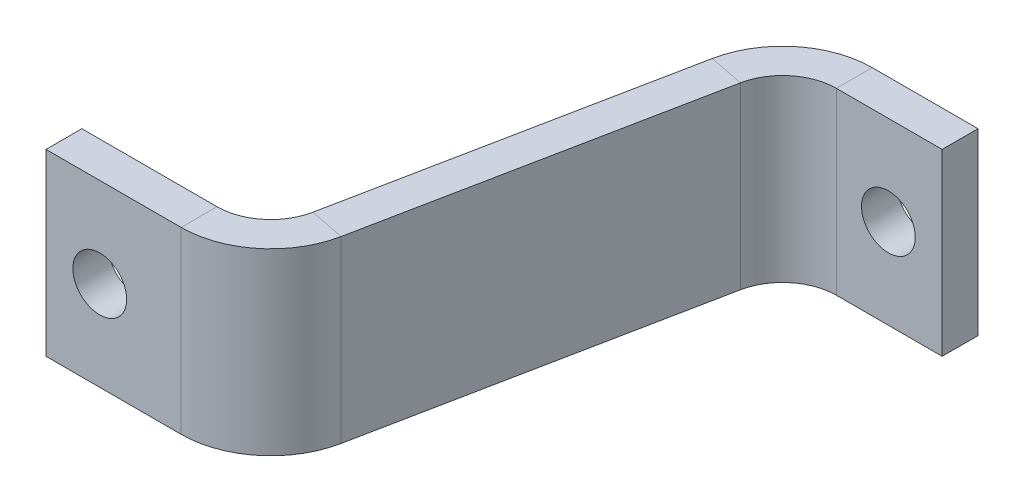
ISO-10303-21;
HEADER;
FILE_DESCRIPTION(('STEP AP214'),'2;1');
FILE_NAME('part.step','',(''),(''),'','','');
FILE_SCHEMA(('AUTOMOTIVE_DESIGN { 1 0 10303 214 1 1 1 1 }'));
ENDSEC;
DATA;
#1=APPLICATION_CONTEXT('core data for automotive mechanical design processes');
#2=APPLICATION_PROTOCOL_DEFINITION('international standard','automotive_design',2000,#1);
#3=PRODUCT_CONTEXT('',#1,'mechanical');
#4=PRODUCT('Part','Part','',(#3));
#5=PRODUCT_RELATED_PRODUCT_CATEGORY('part','',(#4));
#6=PRODUCT_DEFINITION_FORMATION('','',#4);
#7=PRODUCT_DEFINITION_CONTEXT('part definition',#1,'design');
#8=PRODUCT_DEFINITION('design','',#6,#7);
#9=PRODUCT_DEFINITION_SHAPE('','',#8);
#10=(LENGTH_UNIT() NAMED_UNIT(*) SI_UNIT(.MILLI.,.METRE.));
#11=(NAMED_UNIT(*) PLANE_ANGLE_UNIT() SI_UNIT($,.RADIAN.));
#12=(NAMED_UNIT(*) SI_UNIT($,.STERADIAN.) SOLID_ANGLE_UNIT());
#13=UNCERTAINTY_MEASURE_WITH_UNIT(LENGTH_MEASURE(1.E-05),#10,'distance_accuracy_value','');
#14=(GEOMETRIC_REPRESENTATION_CONTEXT(3) GLOBAL_UNCERTAINTY_ASSIGNED_CONTEXT((#13)) GLOBAL_UNIT_ASSIGNED_CONTEXT((#10,
#11,#12)) REPRESENTATION_CONTEXT('',''));
#15=CARTESIAN_POINT('',(0.,0.,0.));
#16=DIRECTION('',(0.,0.,1.));
#17=DIRECTION('',(1.,0.,0.));
#18=AXIS2_PLACEMENT_3D('',#15,#16,#17);
#19=CARTESIAN_POINT('',(-47.2958788935065,10.,20.0273699077237));
#20=DIRECTION('',(0.,1.,0.));
#21=DIRECTION('',(0.,0.,1.));
#22=AXIS2_PLACEMENT_3D('',#19,#20,#21);
#23=PLANE('',#22);
#24=DIRECTION('',(0.98058067569092,0.,0.196116135138183));
#25=VECTOR('',#24,1.);
#26=CARTESIAN_POINT('',(-47.2958788935065,10.,20.0273699077237));
#27=LINE('',#26,#25);
#28=CARTESIAN_POINT('',(-47.2958788935065,10.,20.0273699077237));
#29=VERTEX_POINT('',#28);
#30=CARTESIAN_POINT('',(-45.3347175421246,10.,20.4196021780001));
#31=VERTEX_POINT('',#30);
#32=EDGE_CURVE('E11',#29,#31,#27,.T.);
#33=ORIENTED_EDGE('',*,*,#32,.F.);
#34=CARTESIAN_POINT('',(-50.2376209205792,10.,19.4390215023091));
#35=DIRECTION('',(0.,-1.,0.));
#36=DIRECTION('',(0.,0.,-1.));
#37=AXIS2_PLACEMENT_3D('',#34,#35,#36);
#38=CIRCLE('',#37,3.);
#39=CARTESIAN_POINT('',(-50.2376209205792,10.,22.4390215023091));
#40=VERTEX_POINT('',#39);
#41=EDGE_CURVE('E264',#40,#29,#38,.F.);
#42=ORIENTED_EDGE('',*,*,#41,.F.);
#43=DIRECTION('',(0.,0.,-1.));
#44=VECTOR('',#43,1.);
#45=CARTESIAN_POINT('',(-50.2376209205792,10.,24.4390215023091));
#46=LINE('',#45,#44);
#47=CARTESIAN_POINT('',(-50.2376209205792,10.,24.4390215023091));
#48=VERTEX_POINT('',#47);
#49=EDGE_CURVE('E49',#48,#40,#46,.T.);
#50=ORIENTED_EDGE('',*,*,#49,.F.);
#51=CARTESIAN_POINT('',(-50.2376209205792,10.,19.4390215023091));
#52=DIRECTION('',(0.,1.,0.));
#53=DIRECTION('',(1.,0.,0.));
#54=AXIS2_PLACEMENT_3D('',#51,#52,#53);
#55=CIRCLE('',#54,5.);
#56=EDGE_CURVE('E151',#48,#31,#55,.T.);
#57=ORIENTED_EDGE('',*,*,#56,.T.);
#58=EDGE_LOOP('',(#33,#42,#50,#57));
#59=FACE_BOUND('',#58,.T.);
#60=ADVANCED_FACE('F40',(#59),#23,.T.);
#61=CARTESIAN_POINT('',(-50.2376209205792,10.,24.4390215023091));
#62=DIRECTION('',(0.,1.,0.));
#63=DIRECTION('',(0.,0.,1.));
#64=AXIS2_PLACEMENT_3D('',#61,#62,#63);
#65=PLANE('',#64);
#66=DIRECTION('',(0.196116135138184,0.,-0.98058067569092));
#67=VECTOR('',#66,1.);
#68=CARTESIAN_POINT('',(-47.7782092124236,10.,22.4390215023091));
#69=LINE('',#68,#67);
#70=CARTESIAN_POINT('',(-43.5820930772854,10.,1.45844082661823));
#71=VERTEX_POINT('',#70);
#72=EDGE_CURVE('E145',#29,#71,#69,.T.);
#73=ORIENTED_EDGE('',*,*,#72,.F.);
#74=ORIENTED_EDGE('',*,*,#32,.T.);
#75=DIRECTION('',(0.196116135138184,0.,-0.98058067569092));
#76=VECTOR('',#75,1.);
#77=CARTESIAN_POINT('',(-45.8170478610417,10.,22.8312537725855));
#78=LINE('',#77,#76);
#79=CARTESIAN_POINT('',(-41.6209317259035,10.,1.8506730968946));
#80=VERTEX_POINT('',#79);
#81=EDGE_CURVE('E142',#31,#80,#78,.T.);
#82=ORIENTED_EDGE('',*,*,#81,.T.);
#83=DIRECTION('',(-0.98058067569092,0.,-0.196116135138182));
#84=VECTOR('',#83,1.);
#85=CARTESIAN_POINT('',(-41.6209317259035,10.,1.8506730968946));
#86=LINE('',#85,#84);
#87=EDGE_CURVE('E234',#80,#71,#86,.T.);
#88=ORIENTED_EDGE('',*,*,#87,.T.);
#89=EDGE_LOOP('',(#73,#74,#82,#88));
#90=FACE_BOUND('',#89,.T.);
#91=ADVANCED_FACE('F140',(#90),#65,.T.);
#92=CARTESIAN_POINT('',(-50.2376209205792,0.,22.4390215023091));
#93=DIRECTION('',(0.,-1.,0.));
#94=DIRECTION('',(0.,0.,-1.));
#95=AXIS2_PLACEMENT_3D('',#92,#93,#94);
#96=PLANE('',#95);
#97=DIRECTION('',(0.,0.,1.));
#98=VECTOR('',#97,1.);
#99=CARTESIAN_POINT('',(-50.2376209205792,0.,22.4390215023091));
#100=LINE('',#99,#98);
#101=CARTESIAN_POINT('',(-50.2376209205792,0.,22.4390215023091));
#102=VERTEX_POINT('',#101);
#103=CARTESIAN_POINT('',(-50.2376209205792,0.,24.4390215023091));
#104=VERTEX_POINT('',#103);
#105=EDGE_CURVE('E239',#102,#104,#100,.T.);
#106=ORIENTED_EDGE('',*,*,#105,.F.);
#107=CARTESIAN_POINT('',(-50.2376209205792,0.,19.4390215023091));
#108=DIRECTION('',(0.,-1.,0.));
#109=DIRECTION('',(0.,0.,-1.));
#110=AXIS2_PLACEMENT_3D('',#107,#108,#109);
#111=CIRCLE('',#110,3.);
#112=CARTESIAN_POINT('',(-47.2958788935065,0.,20.0273699077237));
#113=VERTEX_POINT('',#112);
#114=EDGE_CURVE('E191',#102,#113,#111,.F.);
#115=ORIENTED_EDGE('',*,*,#114,.T.);
#116=DIRECTION('',(-0.98058067569092,0.,-0.196116135138183));
#117=VECTOR('',#116,1.);
#118=CARTESIAN_POINT('',(-45.3347175421246,0.,20.4196021780001));
#119=LINE('',#118,#117);
#120=CARTESIAN_POINT('',(-45.3347175421246,0.,20.4196021780001));
#121=VERTEX_POINT('',#120);
#122=EDGE_CURVE('E237',#121,#113,#119,.T.);
#123=ORIENTED_EDGE('',*,*,#122,.F.);
#124=CARTESIAN_POINT('',(-50.2376209205792,0.,19.4390215023091));
#125=DIRECTION('',(0.,1.,0.));
#126=DIRECTION('',(1.,0.,0.));
#127=AXIS2_PLACEMENT_3D('',#124,#125,#126);
#128=CIRCLE('',#127,5.);
#129=EDGE_CURVE('E163',#104,#121,#128,.T.);
#130=ORIENTED_EDGE('',*,*,#129,.F.);
#131=EDGE_LOOP('',(#106,#115,#123,#130));
#132=FACE_BOUND('',#131,.T.);
#133=ADVANCED_FACE('F282',(#132),#96,.T.);
#134=CARTESIAN_POINT('',(-45.3347175421246,0.,20.4196021780001));
#135=DIRECTION('',(0.,-1.,0.));
#136=DIRECTION('',(0.,0.,-1.));
#137=AXIS2_PLACEMENT_3D('',#134,#135,#136);
#138=PLANE('',#137);
#139=DIRECTION('',(1.,0.,0.));
#140=VECTOR('',#139,1.);
#141=CARTESIAN_POINT('',(-57.7782092124235,0.,22.4390215023091));
#142=LINE('',#141,#140);
#143=CARTESIAN_POINT('',(-57.7782092124235,0.,22.4390215023091));
#144=VERTEX_POINT('',#143);
#145=EDGE_CURVE('E194',#144,#102,#142,.T.);
#146=ORIENTED_EDGE('',*,*,#145,.T.);
#147=ORIENTED_EDGE('',*,*,#105,.T.);
#148=DIRECTION('',(1.,0.,0.));
#149=VECTOR('',#148,1.);
#150=CARTESIAN_POINT('',(-57.7782092124235,0.,24.4390215023091));
#151=LINE('',#150,#149);
#152=CARTESIAN_POINT('',(-57.7782092124235,0.,24.4390215023091));
#153=VERTEX_POINT('',#152);
#154=EDGE_CURVE('E200',#153,#104,#151,.T.);
#155=ORIENTED_EDGE('',*,*,#154,.F.);
#156=DIRECTION('',(0.,0.,-1.));
#157=VECTOR('',#156,1.);
#158=CARTESIAN_POINT('',(-57.7782092124235,0.,24.4390215023091));
#159=LINE('',#158,#157);
#160=EDGE_CURVE('E197',#153,#144,#159,.T.);
#161=ORIENTED_EDGE('',*,*,#160,.T.);
#162=EDGE_LOOP('',(#146,#147,#155,#161));
#163=FACE_BOUND('',#162,.T.);
#164=ADVANCED_FACE('F329',(#163),#138,.T.);
#165=CARTESIAN_POINT('',(-38.6791896988308,10.,-2.56097849769086));
#166=DIRECTION('',(0.,1.,0.));
#167=DIRECTION('',(0.,0.,1.));
#168=AXIS2_PLACEMENT_3D('',#165,#166,#167);
#169=PLANE('',#168);
#170=DIRECTION('',(0.,0.,1.));
#171=VECTOR('',#170,1.);
#172=CARTESIAN_POINT('',(-38.6791896988308,10.,-2.56097849769086));
#173=LINE('',#172,#171);
#174=CARTESIAN_POINT('',(-38.6791896988308,10.,-2.56097849769086));
#175=VERTEX_POINT('',#174);
#176=CARTESIAN_POINT('',(-38.6791896988308,10.,-0.560978497690859));
#177=VERTEX_POINT('',#176);
#178=EDGE_CURVE('E58',#175,#177,#173,.T.);
#179=ORIENTED_EDGE('',*,*,#178,.F.);
#180=CARTESIAN_POINT('',(-38.6791896988308,10.,2.43902150230914));
#181=DIRECTION('',(0.,1.,0.));
#182=DIRECTION('',(0.,0.,1.));
#183=AXIS2_PLACEMENT_3D('',#180,#181,#182);
#184=CIRCLE('',#183,5.);
#185=EDGE_CURVE('E260',#71,#175,#184,.F.);
#186=ORIENTED_EDGE('',*,*,#185,.F.);
#187=ORIENTED_EDGE('',*,*,#87,.F.);
#188=CARTESIAN_POINT('',(-38.6791896988308,10.,2.43902150230914));
#189=DIRECTION('',(0.,1.,0.));
#190=DIRECTION('',(1.,0.,0.));
#191=AXIS2_PLACEMENT_3D('',#188,#189,#190);
#192=CIRCLE('',#191,3.);
#193=EDGE_CURVE('E171',#80,#177,#192,.F.);
#194=ORIENTED_EDGE('',*,*,#193,.T.);
#195=EDGE_LOOP('',(#179,#186,#187,#194));
#196=FACE_BOUND('',#195,.T.);
#197=ADVANCED_FACE('F334',(#196),#169,.T.);
#198=CARTESIAN_POINT('',(-41.6209317259035,10.,1.8506730968946));
#199=DIRECTION('',(0.,1.,0.));
#200=DIRECTION('',(0.,0.,1.));
#201=AXIS2_PLACEMENT_3D('',#198,#199,#200);
#202=PLANE('',#201);
#203=DIRECTION('',(1.,0.,0.));
#204=VECTOR('',#203,1.);
#205=CARTESIAN_POINT('',(-42.7782092124236,10.,-2.56097849769086));
#206=LINE('',#205,#204);
#207=CARTESIAN_POINT('',(-32.7782092124236,10.,-2.56097849769086));
#208=VERTEX_POINT('',#207);
#209=EDGE_CURVE('E257',#175,#208,#206,.T.);
#210=ORIENTED_EDGE('',*,*,#209,.F.);
#211=ORIENTED_EDGE('',*,*,#178,.T.);
#212=DIRECTION('',(1.,0.,0.));
#213=VECTOR('',#212,1.);
#214=CARTESIAN_POINT('',(-42.7782092124236,10.,-0.560978497690859));
#215=LINE('',#214,#213);
#216=CARTESIAN_POINT('',(-32.7782092124236,10.,-0.560978497690859));
#217=VERTEX_POINT('',#216);
#218=EDGE_CURVE('E112',#177,#217,#215,.T.);
#219=ORIENTED_EDGE('',*,*,#218,.T.);
#220=DIRECTION('',(0.,0.,1.));
#221=VECTOR('',#220,1.);
#222=CARTESIAN_POINT('',(-32.7782092124236,10.,-2.56097849769086));
#223=LINE('',#222,#221);
#224=EDGE_CURVE('E254',#208,#217,#223,.T.);
#225=ORIENTED_EDGE('',*,*,#224,.F.);
#226=EDGE_LOOP('',(#210,#211,#219,#225));
#227=FACE_BOUND('',#226,.T.);
#228=ADVANCED_FACE('F309',(#227),#202,.T.);
#229=CARTESIAN_POINT('',(-43.5820930772854,0.,1.45844082661823));
#230=DIRECTION('',(0.,-1.,0.));
#231=DIRECTION('',(0.,0.,-1.));
#232=AXIS2_PLACEMENT_3D('',#229,#230,#231);
#233=PLANE('',#232);
#234=DIRECTION('',(0.98058067569092,0.,0.196116135138182));
#235=VECTOR('',#234,1.);
#236=CARTESIAN_POINT('',(-43.5820930772854,0.,1.45844082661823));
#237=LINE('',#236,#235);
#238=CARTESIAN_POINT('',(-43.5820930772854,0.,1.45844082661823));
#239=VERTEX_POINT('',#238);
#240=CARTESIAN_POINT('',(-41.6209317259035,0.,1.8506730968946));
#241=VERTEX_POINT('',#240);
#242=EDGE_CURVE('E99',#239,#241,#237,.T.);
#243=ORIENTED_EDGE('',*,*,#242,.F.);
#244=CARTESIAN_POINT('',(-38.6791896988308,0.,2.43902150230914));
#245=DIRECTION('',(0.,1.,0.));
#246=DIRECTION('',(0.,0.,1.));
#247=AXIS2_PLACEMENT_3D('',#244,#245,#246);
#248=CIRCLE('',#247,5.);
#249=CARTESIAN_POINT('',(-38.6791896988308,0.,-2.56097849769086));
#250=VERTEX_POINT('',#249);
#251=EDGE_CURVE('E187',#239,#250,#248,.F.);
#252=ORIENTED_EDGE('',*,*,#251,.T.);
#253=DIRECTION('',(0.,0.,-1.));
#254=VECTOR('',#253,1.);
#255=CARTESIAN_POINT('',(-38.6791896988308,0.,-0.560978497690859));
#256=LINE('',#255,#254);
#257=CARTESIAN_POINT('',(-38.6791896988308,0.,-0.560978497690859));
#258=VERTEX_POINT('',#257);
#259=EDGE_CURVE('E106',#258,#250,#256,.T.);
#260=ORIENTED_EDGE('',*,*,#259,.F.);
#261=CARTESIAN_POINT('',(-38.6791896988308,0.,2.43902150230914));
#262=DIRECTION('',(0.,1.,0.));
#263=DIRECTION('',(1.,0.,0.));
#264=AXIS2_PLACEMENT_3D('',#261,#262,#263);
#265=CIRCLE('',#264,3.);
#266=EDGE_CURVE('E206',#241,#258,#265,.F.);
#267=ORIENTED_EDGE('',*,*,#266,.F.);
#268=EDGE_LOOP('',(#243,#252,#260,#267));
#269=FACE_BOUND('',#268,.T.);
#270=ADVANCED_FACE('F297',(#269),#233,.T.);
#271=CARTESIAN_POINT('',(-38.6791896988308,0.,-0.560978497690859));
#272=DIRECTION('',(0.,-1.,0.));
#273=DIRECTION('',(0.,0.,-1.));
#274=AXIS2_PLACEMENT_3D('',#271,#272,#273);
#275=PLANE('',#274);
#276=DIRECTION('',(0.196116135138184,0.,-0.98058067569092));
#277=VECTOR('',#276,1.);
#278=CARTESIAN_POINT('',(-47.7782092124236,0.,22.4390215023091));
#279=LINE('',#278,#277);
#280=EDGE_CURVE('E189',#113,#239,#279,.T.);
#281=ORIENTED_EDGE('',*,*,#280,.T.);
#282=ORIENTED_EDGE('',*,*,#242,.T.);
#283=DIRECTION('',(0.196116135138184,0.,-0.98058067569092));
#284=VECTOR('',#283,1.);
#285=CARTESIAN_POINT('',(-45.8170478610417,0.,22.8312537725855));
#286=LINE('',#285,#284);
#287=EDGE_CURVE('E204',#121,#241,#286,.T.);
#288=ORIENTED_EDGE('',*,*,#287,.F.);
#289=ORIENTED_EDGE('',*,*,#122,.T.);
#290=EDGE_LOOP('',(#281,#282,#288,#289));
#291=FACE_BOUND('',#290,.T.);
#292=ADVANCED_FACE('F284',(#291),#275,.T.);
#293=CARTESIAN_POINT('',(-42.7782092124236,10.,-0.560978497690859));
#294=DIRECTION('',(0.,0.,-1.));
#295=DIRECTION('',(-1.,0.,0.));
#296=AXIS2_PLACEMENT_3D('',#293,#294,#295);
#297=PLANE('',#296);
#298=CARTESIAN_POINT('',(-35.7782092124236,5.,-0.560978497690859));
#299=DIRECTION('',(0.,0.,1.));
#300=DIRECTION('',(1.,0.,0.));
#301=AXIS2_PLACEMENT_3D('',#298,#299,#300);
#302=CIRCLE('',#301,1.5);
#303=CARTESIAN_POINT('',(-34.2782092124236,5.,-0.560978497690859));
#304=VERTEX_POINT('',#303);
#305=EDGE_CURVE('E250',#304,#304,#302,.T.);
#306=ORIENTED_EDGE('',*,*,#305,.F.);
#307=EDGE_LOOP('',(#306));
#308=FACE_BOUND('',#307,.T.);
#309=DIRECTION('',(1.,0.,0.));
#310=VECTOR('',#309,1.);
#311=CARTESIAN_POINT('',(-42.7782092124236,0.,-0.560978497690859));
#312=LINE('',#311,#310);
#313=CARTESIAN_POINT('',(-32.7782092124236,0.,-0.560978497690859));
#314=VERTEX_POINT('',#313);
#315=EDGE_CURVE('E177',#258,#314,#312,.T.);
#316=ORIENTED_EDGE('',*,*,#315,.T.);
#317=DIRECTION('',(0.,-1.,0.));
#318=VECTOR('',#317,1.);
#319=CARTESIAN_POINT('',(-32.7782092124236,10.,-0.560978497690859));
#320=LINE('',#319,#318);
#321=EDGE_CURVE('E230',#217,#314,#320,.T.);
#322=ORIENTED_EDGE('',*,*,#321,.F.);
#323=ORIENTED_EDGE('',*,*,#218,.F.);
#324=DIRECTION('',(0.,-1.,0.));
#325=VECTOR('',#324,1.);
#326=CARTESIAN_POINT('',(-38.6791896988308,10.,-0.560978497690859));
#327=LINE('',#326,#325);
#328=EDGE_CURVE('E173',#177,#258,#327,.T.);
#329=ORIENTED_EDGE('',*,*,#328,.T.);
#330=EDGE_LOOP('',(#316,#322,#323,#329));
#331=FACE_BOUND('',#330,.T.);
#332=ADVANCED_FACE('F303',(#308,#331),#297,.F.);
#333=CARTESIAN_POINT('',(-32.7782092124236,10.,-2.56097849769086));
#334=DIRECTION('',(1.,0.,0.));
#335=DIRECTION('',(0.,0.,-1.));
#336=AXIS2_PLACEMENT_3D('',#333,#334,#335);
#337=PLANE('',#336);
#338=DIRECTION('',(0.,0.,1.));
#339=VECTOR('',#338,1.);
#340=CARTESIAN_POINT('',(-32.7782092124236,0.,-2.56097849769086));
#341=LINE('',#340,#339);
#342=CARTESIAN_POINT('',(-32.7782092124236,0.,-2.56097849769086));
#343=VERTEX_POINT('',#342);
#344=EDGE_CURVE('E180',#343,#314,#341,.T.);
#345=ORIENTED_EDGE('',*,*,#344,.F.);
#346=DIRECTION('',(0.,-1.,0.));
#347=VECTOR('',#346,1.);
#348=CARTESIAN_POINT('',(-32.7782092124236,10.,-2.56097849769086));
#349=LINE('',#348,#347);
#350=EDGE_CURVE('E228',#208,#343,#349,.T.);
#351=ORIENTED_EDGE('',*,*,#350,.F.);
#352=ORIENTED_EDGE('',*,*,#224,.T.);
#353=ORIENTED_EDGE('',*,*,#321,.T.);
#354=EDGE_LOOP('',(#345,#351,#352,#353));
#355=FACE_BOUND('',#354,.T.);
#356=ADVANCED_FACE('F308',(#355),#337,.T.);
#357=CARTESIAN_POINT('',(-42.7782092124236,10.,-2.56097849769086));
#358=DIRECTION('',(0.,0.,-1.));
#359=DIRECTION('',(-1.,0.,0.));
#360=AXIS2_PLACEMENT_3D('',#357,#358,#359);
#361=PLANE('',#360);
#362=CARTESIAN_POINT('',(-35.7782092124236,5.,-2.56097849769086));
#363=DIRECTION('',(0.,0.,-1.));
#364=DIRECTION('',(-1.,0.,0.));
#365=AXIS2_PLACEMENT_3D('',#362,#363,#364);
#366=CIRCLE('',#365,1.5);
#367=CARTESIAN_POINT('',(-37.2782092124235,5.,-2.56097849769086));
#368=VERTEX_POINT('',#367);
#369=EDGE_CURVE('E43',#368,#368,#366,.T.);
#370=ORIENTED_EDGE('',*,*,#369,.F.);
#371=EDGE_LOOP('',(#370));
#372=FACE_BOUND('',#371,.T.);
#373=DIRECTION('',(1.,0.,0.));
#374=VECTOR('',#373,1.);
#375=CARTESIAN_POINT('',(-42.7782092124236,0.,-2.56097849769086));
#376=LINE('',#375,#374);
#377=EDGE_CURVE('E184',#250,#343,#376,.T.);
#378=ORIENTED_EDGE('',*,*,#377,.F.);
#379=DIRECTION('',(0.,-1.,0.));
#380=VECTOR('',#379,1.);
#381=CARTESIAN_POINT('',(-38.6791896988308,10.,-2.56097849769086));
#382=LINE('',#381,#380);
#383=EDGE_CURVE('E225',#175,#250,#382,.T.);
#384=ORIENTED_EDGE('',*,*,#383,.F.);
#385=ORIENTED_EDGE('',*,*,#209,.T.);
#386=ORIENTED_EDGE('',*,*,#350,.T.);
#387=EDGE_LOOP('',(#378,#384,#385,#386));
#388=FACE_BOUND('',#387,.T.);
#389=ADVANCED_FACE('F311',(#372,#388),#361,.T.);
#390=CARTESIAN_POINT('',(-38.6791896988308,10.,2.43902150230914));
#391=DIRECTION('',(0.,-1.,0.));
#392=DIRECTION('',(0.,0.,-1.));
#393=AXIS2_PLACEMENT_3D('',#390,#391,#392);
#394=CYLINDRICAL_SURFACE('',#393,5.);
#395=ORIENTED_EDGE('',*,*,#251,.F.);
#396=DIRECTION('',(0.,-1.,0.));
#397=VECTOR('',#396,1.);
#398=CARTESIAN_POINT('',(-43.5820930772854,10.,1.45844082661823));
#399=LINE('',#398,#397);
#400=EDGE_CURVE('E222',#71,#239,#399,.T.);
#401=ORIENTED_EDGE('',*,*,#400,.F.);
#402=ORIENTED_EDGE('',*,*,#185,.T.);
#403=ORIENTED_EDGE('',*,*,#383,.T.);
#404=EDGE_LOOP('',(#395,#401,#402,#403));
#405=FACE_BOUND('',#404,.T.);
#406=ADVANCED_FACE('F294',(#405),#394,.T.);
#407=CARTESIAN_POINT('',(-47.7782092124236,10.,22.4390215023091));
#408=DIRECTION('',(-0.98058067569092,0.,-0.196116135138184));
#409=DIRECTION('',(-0.196116135138184,0.,0.98058067569092));
#410=AXIS2_PLACEMENT_3D('',#407,#408,#409);
#411=PLANE('',#410);
#412=ORIENTED_EDGE('',*,*,#280,.F.);
#413=DIRECTION('',(0.,-1.,0.));
#414=VECTOR('',#413,1.);
#415=CARTESIAN_POINT('',(-47.2958788935065,10.,20.0273699077237));
#416=LINE('',#415,#414);
#417=EDGE_CURVE('E219',#29,#113,#416,.T.);
#418=ORIENTED_EDGE('',*,*,#417,.F.);
#419=ORIENTED_EDGE('',*,*,#72,.T.);
#420=ORIENTED_EDGE('',*,*,#400,.T.);
#421=EDGE_LOOP('',(#412,#418,#419,#420));
#422=FACE_BOUND('',#421,.T.);
#423=ADVANCED_FACE('F289',(#422),#411,.T.);
#424=CARTESIAN_POINT('',(-50.2376209205792,10.,19.4390215023091));
#425=DIRECTION('',(0.,-1.,0.));
#426=DIRECTION('',(0.,0.,-1.));
#427=AXIS2_PLACEMENT_3D('',#424,#425,#426);
#428=CYLINDRICAL_SURFACE('',#427,3.);
#429=ORIENTED_EDGE('',*,*,#114,.F.);
#430=DIRECTION('',(0.,-1.,0.));
#431=VECTOR('',#430,1.);
#432=CARTESIAN_POINT('',(-50.2376209205792,10.,22.4390215023091));
#433=LINE('',#432,#431);
#434=EDGE_CURVE('E216',#40,#102,#433,.T.);
#435=ORIENTED_EDGE('',*,*,#434,.F.);
#436=ORIENTED_EDGE('',*,*,#41,.T.);
#437=ORIENTED_EDGE('',*,*,#417,.T.);
#438=EDGE_LOOP('',(#429,#435,#436,#437));
#439=FACE_BOUND('',#438,.T.);
#440=ADVANCED_FACE('F287',(#439),#428,.F.);
#441=CARTESIAN_POINT('',(-57.7782092124235,10.,22.4390215023091));
#442=DIRECTION('',(0.,0.,-1.));
#443=DIRECTION('',(-1.,0.,0.));
#444=AXIS2_PLACEMENT_3D('',#441,#442,#443);
#445=PLANE('',#444);
#446=CARTESIAN_POINT('',(-54.7782092124235,5.,22.4390215023091));
#447=DIRECTION('',(0.,0.,-1.));
#448=DIRECTION('',(-1.,0.,0.));
#449=AXIS2_PLACEMENT_3D('',#446,#447,#448);
#450=CIRCLE('',#449,1.5);
#451=CARTESIAN_POINT('',(-56.2782092124235,5.,22.4390215023091));
#452=VERTEX_POINT('',#451);
#453=EDGE_CURVE('E242',#452,#452,#450,.T.);
#454=ORIENTED_EDGE('',*,*,#453,.F.);
#455=EDGE_LOOP('',(#454));
#456=FACE_BOUND('',#455,.T.);
#457=ORIENTED_EDGE('',*,*,#145,.F.);
#458=DIRECTION('',(0.,-1.,0.));
#459=VECTOR('',#458,1.);
#460=CARTESIAN_POINT('',(-57.7782092124235,10.,22.4390215023091));
#461=LINE('',#460,#459);
#462=CARTESIAN_POINT('',(-57.7782092124235,10.,22.4390215023091));
#463=VERTEX_POINT('',#462);
#464=EDGE_CURVE('E214',#463,#144,#461,.T.);
#465=ORIENTED_EDGE('',*,*,#464,.F.);
#466=DIRECTION('',(1.,0.,0.));
#467=VECTOR('',#466,1.);
#468=CARTESIAN_POINT('',(-57.7782092124235,10.,22.4390215023091));
#469=LINE('',#468,#467);
#470=EDGE_CURVE('E266',#463,#40,#469,.T.);
#471=ORIENTED_EDGE('',*,*,#470,.T.);
#472=ORIENTED_EDGE('',*,*,#434,.T.);
#473=EDGE_LOOP('',(#457,#465,#471,#472));
#474=FACE_BOUND('',#473,.T.);
#475=ADVANCED_FACE('F377',(#456,#474),#445,.T.);
#476=CARTESIAN_POINT('',(-57.7782092124235,10.,24.4390215023091));
#477=DIRECTION('',(-1.,0.,0.));
#478=DIRECTION('',(0.,0.,1.));
#479=AXIS2_PLACEMENT_3D('',#476,#477,#478);
#480=PLANE('',#479);
#481=ORIENTED_EDGE('',*,*,#160,.F.);
#482=DIRECTION('',(0.,-1.,0.));
#483=VECTOR('',#482,1.);
#484=CARTESIAN_POINT('',(-57.7782092124235,10.,24.4390215023091));
#485=LINE('',#484,#483);
#486=CARTESIAN_POINT('',(-57.7782092124235,10.,24.4390215023091));
#487=VERTEX_POINT('',#486);
#488=EDGE_CURVE('E212',#487,#153,#485,.T.);
#489=ORIENTED_EDGE('',*,*,#488,.F.);
#490=DIRECTION('',(0.,0.,-1.));
#491=VECTOR('',#490,1.);
#492=CARTESIAN_POINT('',(-57.7782092124235,10.,24.4390215023091));
#493=LINE('',#492,#491);
#494=EDGE_CURVE('E269',#487,#463,#493,.T.);
#495=ORIENTED_EDGE('',*,*,#494,.T.);
#496=ORIENTED_EDGE('',*,*,#464,.T.);
#497=EDGE_LOOP('',(#481,#489,#495,#496));
#498=FACE_BOUND('',#497,.T.);
#499=ADVANCED_FACE('F374',(#498),#480,.T.);
#500=CARTESIAN_POINT('',(-57.7782092124235,10.,24.4390215023091));
#501=DIRECTION('',(0.,0.,-1.));
#502=DIRECTION('',(-1.,0.,0.));
#503=AXIS2_PLACEMENT_3D('',#500,#501,#502);
#504=PLANE('',#503);
#505=CARTESIAN_POINT('',(-54.7782092124235,5.,24.4390215023091));
#506=DIRECTION('',(0.,0.,-1.));
#507=DIRECTION('',(-1.,0.,0.));
#508=AXIS2_PLACEMENT_3D('',#505,#506,#507);
#509=CIRCLE('',#508,1.5);
#510=CARTESIAN_POINT('',(-56.2782092124235,5.,24.4390215023091));
#511=VERTEX_POINT('',#510);
#512=EDGE_CURVE('E181',#511,#511,#509,.T.);
#513=ORIENTED_EDGE('',*,*,#512,.T.);
#514=EDGE_LOOP('',(#513));
#515=FACE_BOUND('',#514,.T.);
#516=ORIENTED_EDGE('',*,*,#154,.T.);
#517=DIRECTION('',(0.,-1.,0.));
#518=VECTOR('',#517,1.);
#519=CARTESIAN_POINT('',(-50.2376209205792,10.,24.4390215023091));
#520=LINE('',#519,#518);
#521=EDGE_CURVE('E165',#48,#104,#520,.T.);
#522=ORIENTED_EDGE('',*,*,#521,.F.);
#523=DIRECTION('',(1.,0.,0.));
#524=VECTOR('',#523,1.);
#525=CARTESIAN_POINT('',(-57.7782092124235,10.,24.4390215023091));
#526=LINE('',#525,#524);
#527=EDGE_CURVE('E156',#487,#48,#526,.T.);
#528=ORIENTED_EDGE('',*,*,#527,.F.);
#529=ORIENTED_EDGE('',*,*,#488,.T.);
#530=EDGE_LOOP('',(#516,#522,#528,#529));
#531=FACE_BOUND('',#530,.T.);
#532=ADVANCED_FACE('F279',(#515,#531),#504,.F.);
#533=CARTESIAN_POINT('',(-50.2376209205792,10.,19.4390215023091));
#534=DIRECTION('',(0.,-1.,0.));
#535=DIRECTION('',(0.,0.,-1.));
#536=AXIS2_PLACEMENT_3D('',#533,#534,#535);
#537=CYLINDRICAL_SURFACE('',#536,5.);
#538=ORIENTED_EDGE('',*,*,#129,.T.);
#539=DIRECTION('',(0.,-1.,0.));
#540=VECTOR('',#539,1.);
#541=CARTESIAN_POINT('',(-45.3347175421246,10.,20.4196021780001));
#542=LINE('',#541,#540);
#543=EDGE_CURVE('E160',#31,#121,#542,.T.);
#544=ORIENTED_EDGE('',*,*,#543,.F.);
#545=ORIENTED_EDGE('',*,*,#56,.F.);
#546=ORIENTED_EDGE('',*,*,#521,.T.);
#547=EDGE_LOOP('',(#538,#544,#545,#546));
#548=FACE_BOUND('',#547,.T.);
#549=ADVANCED_FACE('F161',(#548),#537,.T.);
#550=CARTESIAN_POINT('',(-45.8170478610417,10.,22.8312537725855));
#551=DIRECTION('',(-0.98058067569092,0.,-0.196116135138184));
#552=DIRECTION('',(-0.196116135138184,0.,0.98058067569092));
#553=AXIS2_PLACEMENT_3D('',#550,#551,#552);
#554=PLANE('',#553);
#555=ORIENTED_EDGE('',*,*,#287,.T.);
#556=DIRECTION('',(0.,-1.,0.));
#557=VECTOR('',#556,1.);
#558=CARTESIAN_POINT('',(-41.6209317259035,10.,1.8506730968946));
#559=LINE('',#558,#557);
#560=EDGE_CURVE('E166',#80,#241,#559,.T.);
#561=ORIENTED_EDGE('',*,*,#560,.F.);
#562=ORIENTED_EDGE('',*,*,#81,.F.);
#563=ORIENTED_EDGE('',*,*,#543,.T.);
#564=EDGE_LOOP('',(#555,#561,#562,#563));
#565=FACE_BOUND('',#564,.T.);
#566=ADVANCED_FACE('F168',(#565),#554,.F.);
#567=CARTESIAN_POINT('',(-38.6791896988308,10.,2.43902150230914));
#568=DIRECTION('',(0.,-1.,0.));
#569=DIRECTION('',(0.,0.,-1.));
#570=AXIS2_PLACEMENT_3D('',#567,#568,#569);
#571=CYLINDRICAL_SURFACE('',#570,3.);
#572=ORIENTED_EDGE('',*,*,#266,.T.);
#573=ORIENTED_EDGE('',*,*,#328,.F.);
#574=ORIENTED_EDGE('',*,*,#193,.F.);
#575=ORIENTED_EDGE('',*,*,#560,.T.);
#576=EDGE_LOOP('',(#572,#573,#574,#575));
#577=FACE_BOUND('',#576,.T.);
#578=ADVANCED_FACE('F300',(#577),#571,.F.);
#579=CARTESIAN_POINT('',(-38.6791896988308,10.,2.43902150230914));
#580=DIRECTION('',(0.,1.,0.));
#581=DIRECTION('',(1.,0.,0.));
#582=AXIS2_PLACEMENT_3D('',#579,#580,#581);
#583=PLANE('',#582);
#584=ORIENTED_EDGE('',*,*,#527,.T.);
#585=ORIENTED_EDGE('',*,*,#49,.T.);
#586=ORIENTED_EDGE('',*,*,#470,.F.);
#587=ORIENTED_EDGE('',*,*,#494,.F.);
#588=EDGE_LOOP('',(#584,#585,#586,#587));
#589=FACE_BOUND('',#588,.T.);
#590=ADVANCED_FACE('F275',(#589),#583,.T.);
#591=CARTESIAN_POINT('',(-38.6791896988308,0.,2.43902150230914));
#592=DIRECTION('',(0.,1.,0.));
#593=DIRECTION('',(1.,0.,0.));
#594=AXIS2_PLACEMENT_3D('',#591,#592,#593);
#595=PLANE('',#594);
#596=ORIENTED_EDGE('',*,*,#315,.F.);
#597=ORIENTED_EDGE('',*,*,#259,.T.);
#598=ORIENTED_EDGE('',*,*,#377,.T.);
#599=ORIENTED_EDGE('',*,*,#344,.T.);
#600=EDGE_LOOP('',(#596,#597,#598,#599));
#601=FACE_BOUND('',#600,.T.);
#602=ADVANCED_FACE('F305',(#601),#595,.F.);
#603=CARTESIAN_POINT('',(-54.7782092124235,5.,32.4390215023091));
#604=DIRECTION('',(0.,0.,-1.));
#605=DIRECTION('',(-1.,0.,0.));
#606=AXIS2_PLACEMENT_3D('',#603,#604,#605);
#607=CYLINDRICAL_SURFACE('',#606,1.5);
#608=ORIENTED_EDGE('',*,*,#453,.T.);
#609=EDGE_LOOP('',(#608));
#610=FACE_BOUND('',#609,.T.);
#611=ORIENTED_EDGE('',*,*,#512,.F.);
#612=EDGE_LOOP('',(#611));
#613=FACE_BOUND('',#612,.T.);
#614=ADVANCED_FACE('F354',(#610,#613),#607,.F.);
#615=CARTESIAN_POINT('',(-35.7782092124236,5.,-10.5609784976909));
#616=DIRECTION('',(0.,0.,1.));
#617=DIRECTION('',(1.,0.,0.));
#618=AXIS2_PLACEMENT_3D('',#615,#616,#617);
#619=CYLINDRICAL_SURFACE('',#618,1.5);
#620=ORIENTED_EDGE('',*,*,#369,.T.);
#621=EDGE_LOOP('',(#620));
#622=FACE_BOUND('',#621,.T.);
#623=ORIENTED_EDGE('',*,*,#305,.T.);
#624=EDGE_LOOP('',(#623));
#625=FACE_BOUND('',#624,.T.);
#626=ADVANCED_FACE('F352',(#622,#625),#619,.F.);
#627=CLOSED_SHELL('',(#60,#91,#133,#164,#197,#228,#270,#292,#332,#356,#389,#406,#423,#440,#475,
#499,#532,#549,#566,#578,#590,#602,#614,#626));
#628=MANIFOLD_SOLID_BREP('B2',#627);
#629=ADVANCED_BREP_SHAPE_REPRESENTATION('',(#18,#628),#14);
#630=SHAPE_DEFINITION_REPRESENTATION(#9,#629);
ENDSEC;
END-ISO-10303-21;
